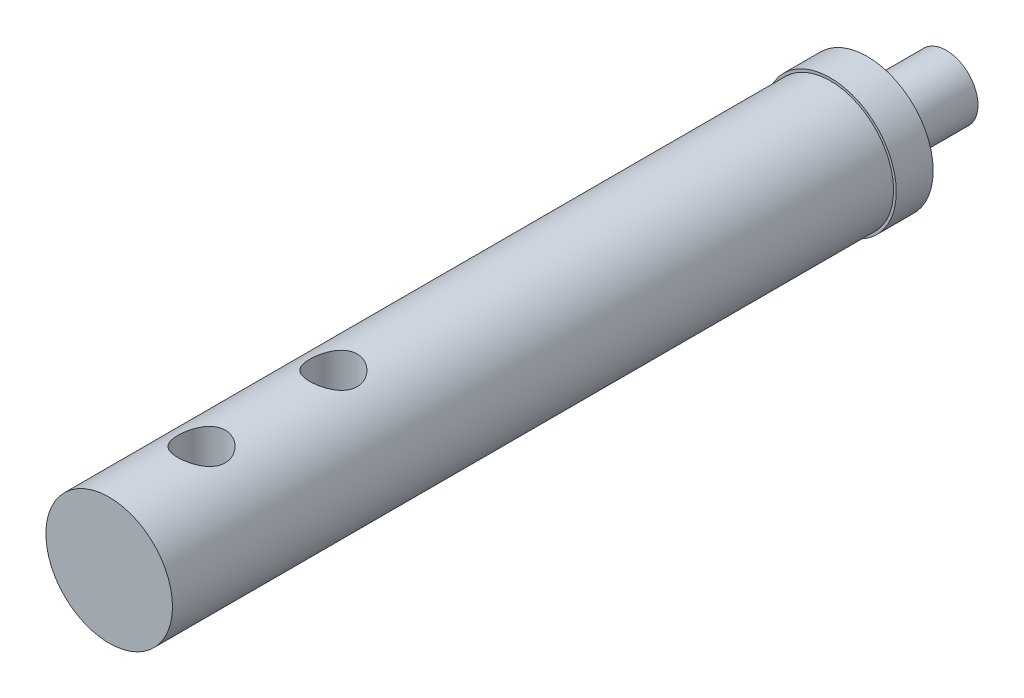
ISO-10303-21;
HEADER;
FILE_DESCRIPTION(('STEP AP214'),'2;1');
FILE_NAME('part.step','',(''),(''),'','','');
FILE_SCHEMA(('AUTOMOTIVE_DESIGN { 1 0 10303 214 1 1 1 1 }'));
ENDSEC;
DATA;
#1=APPLICATION_CONTEXT('core data for automotive mechanical design processes');
#2=APPLICATION_PROTOCOL_DEFINITION('international standard','automotive_design',2000,#1);
#3=PRODUCT_CONTEXT('',#1,'mechanical');
#4=PRODUCT('Part','Part','',(#3));
#5=PRODUCT_RELATED_PRODUCT_CATEGORY('part','',(#4));
#6=PRODUCT_DEFINITION_FORMATION('','',#4);
#7=PRODUCT_DEFINITION_CONTEXT('part definition',#1,'design');
#8=PRODUCT_DEFINITION('design','',#6,#7);
#9=PRODUCT_DEFINITION_SHAPE('','',#8);
#10=(LENGTH_UNIT() NAMED_UNIT(*) SI_UNIT(.MILLI.,.METRE.));
#11=(NAMED_UNIT(*) PLANE_ANGLE_UNIT() SI_UNIT($,.RADIAN.));
#12=(NAMED_UNIT(*) SI_UNIT($,.STERADIAN.) SOLID_ANGLE_UNIT());
#13=UNCERTAINTY_MEASURE_WITH_UNIT(LENGTH_MEASURE(1.E-05),#10,'distance_accuracy_value','');
#14=(GEOMETRIC_REPRESENTATION_CONTEXT(3) GLOBAL_UNCERTAINTY_ASSIGNED_CONTEXT((#13)) GLOBAL_UNIT_ASSIGNED_CONTEXT((#10,
#11,#12)) REPRESENTATION_CONTEXT('',''));
#15=CARTESIAN_POINT('',(0.,0.,0.));
#16=DIRECTION('',(0.,0.,1.));
#17=DIRECTION('',(1.,0.,0.));
#18=AXIS2_PLACEMENT_3D('',#15,#16,#17);
#19=CARTESIAN_POINT('',(0.,0.,15.));
#20=DIRECTION('',(0.,0.,-1.));
#21=DIRECTION('',(-1.,0.,0.));
#22=AXIS2_PLACEMENT_3D('',#19,#20,#21);
#23=CYLINDRICAL_SURFACE('',#22,6.);
#24=CARTESIAN_POINT('',(0.,0.,15.));
#25=DIRECTION('',(0.,0.,1.));
#26=DIRECTION('',(1.,0.,0.));
#27=AXIS2_PLACEMENT_3D('',#24,#25,#26);
#28=CIRCLE('',#27,6.);
#29=CARTESIAN_POINT('',(6.,0.,15.));
#30=VERTEX_POINT('',#29);
#31=EDGE_CURVE('E45',#30,#30,#28,.T.);
#32=ORIENTED_EDGE('',*,*,#31,.F.);
#33=EDGE_LOOP('',(#32));
#34=FACE_BOUND('',#33,.T.);
#35=CARTESIAN_POINT('',(0.,0.,0.));
#36=DIRECTION('',(0.,0.,1.));
#37=DIRECTION('',(1.,0.,0.));
#38=AXIS2_PLACEMENT_3D('',#35,#36,#37);
#39=CIRCLE('',#38,6.);
#40=CARTESIAN_POINT('',(6.,0.,0.));
#41=VERTEX_POINT('',#40);
#42=EDGE_CURVE('E50',#41,#41,#39,.T.);
#43=ORIENTED_EDGE('',*,*,#42,.T.);
#44=EDGE_LOOP('',(#43));
#45=FACE_BOUND('',#44,.T.);
#46=ADVANCED_FACE('F33',(#34,#45),#23,.T.);
#47=CARTESIAN_POINT('',(0.,0.,0.));
#48=DIRECTION('',(0.,0.,1.));
#49=DIRECTION('',(1.,0.,0.));
#50=AXIS2_PLACEMENT_3D('',#47,#48,#49);
#51=PLANE('',#50);
#52=ORIENTED_EDGE('',*,*,#42,.F.);
#53=EDGE_LOOP('',(#52));
#54=FACE_BOUND('',#53,.T.);
#55=ADVANCED_FACE('F95',(#54),#51,.F.);
#56=CARTESIAN_POINT('',(0.,0.,22.));
#57=DIRECTION('',(0.,0.,-1.));
#58=DIRECTION('',(-1.,0.,0.));
#59=AXIS2_PLACEMENT_3D('',#56,#57,#58);
#60=CYLINDRICAL_SURFACE('',#59,12.5);
#61=CARTESIAN_POINT('',(0.,0.,22.));
#62=DIRECTION('',(0.,0.,1.));
#63=DIRECTION('',(1.,0.,0.));
#64=AXIS2_PLACEMENT_3D('',#61,#62,#63);
#65=CIRCLE('',#64,12.5);
#66=CARTESIAN_POINT('',(12.5,0.,22.));
#67=VERTEX_POINT('',#66);
#68=EDGE_CURVE('E55',#67,#67,#65,.T.);
#69=ORIENTED_EDGE('',*,*,#68,.F.);
#70=EDGE_LOOP('',(#69));
#71=FACE_BOUND('',#70,.T.);
#72=CARTESIAN_POINT('',(0.,0.,15.));
#73=DIRECTION('',(0.,0.,1.));
#74=DIRECTION('',(1.,0.,0.));
#75=AXIS2_PLACEMENT_3D('',#72,#73,#74);
#76=CIRCLE('',#75,12.5);
#77=CARTESIAN_POINT('',(12.5,0.,15.));
#78=VERTEX_POINT('',#77);
#79=EDGE_CURVE('E58',#78,#78,#76,.T.);
#80=ORIENTED_EDGE('',*,*,#79,.T.);
#81=EDGE_LOOP('',(#80));
#82=FACE_BOUND('',#81,.T.);
#83=ADVANCED_FACE('F100',(#71,#82),#60,.T.);
#84=CARTESIAN_POINT('',(0.,0.,22.));
#85=DIRECTION('',(0.,0.,1.));
#86=DIRECTION('',(1.,0.,0.));
#87=AXIS2_PLACEMENT_3D('',#84,#85,#86);
#88=PLANE('',#87);
#89=CARTESIAN_POINT('',(0.,0.,22.));
#90=DIRECTION('',(0.,0.,1.));
#91=DIRECTION('',(1.,0.,0.));
#92=AXIS2_PLACEMENT_3D('',#89,#90,#91);
#93=CIRCLE('',#92,12.);
#94=CARTESIAN_POINT('',(12.,0.,22.));
#95=VERTEX_POINT('',#94);
#96=EDGE_CURVE('E10',#95,#95,#93,.T.);
#97=ORIENTED_EDGE('',*,*,#96,.F.);
#98=EDGE_LOOP('',(#97));
#99=FACE_BOUND('',#98,.T.);
#100=ORIENTED_EDGE('',*,*,#68,.T.);
#101=EDGE_LOOP('',(#100));
#102=FACE_BOUND('',#101,.T.);
#103=ADVANCED_FACE('F108',(#99,#102),#88,.T.);
#104=CARTESIAN_POINT('',(0.,0.,15.));
#105=DIRECTION('',(0.,0.,1.));
#106=DIRECTION('',(1.,0.,0.));
#107=AXIS2_PLACEMENT_3D('',#104,#105,#106);
#108=PLANE('',#107);
#109=ORIENTED_EDGE('',*,*,#31,.T.);
#110=EDGE_LOOP('',(#109));
#111=FACE_BOUND('',#110,.T.);
#112=ORIENTED_EDGE('',*,*,#79,.F.);
#113=EDGE_LOOP('',(#112));
#114=FACE_BOUND('',#113,.T.);
#115=ADVANCED_FACE('F91',(#111,#114),#108,.F.);
#116=CARTESIAN_POINT('',(0.,0.,158.7));
#117=DIRECTION('',(0.,0.,-1.));
#118=DIRECTION('',(-1.,0.,0.));
#119=AXIS2_PLACEMENT_3D('',#116,#117,#118);
#120=CYLINDRICAL_SURFACE('',#119,12.);
#121=CARTESIAN_POINT('',(0.,-12.,120.7));
#122=CARTESIAN_POINT('',(0.12182192021614,-12.0000004149463,120.700000562589));
#123=CARTESIAN_POINT('',(0.243636002691334,-11.9981409348073,120.695049364538));
#124=CARTESIAN_POINT('',(0.486392423781213,-11.9907535477711,120.675293911887));
#125=CARTESIAN_POINT('',(0.607334471202249,-11.9852244680872,120.660486507286));
#126=CARTESIAN_POINT('',(0.847347381687181,-11.970649565472,120.621174413435));
#127=CARTESIAN_POINT('',(0.966419205128127,-11.9616056132673,120.596674882519));
#128=CARTESIAN_POINT('',(1.20195810401349,-11.9402382455256,120.53820576059));
#129=CARTESIAN_POINT('',(1.31842414848255,-11.9279135559973,120.504232490447));
#130=CARTESIAN_POINT('',(1.54765442429003,-11.9003384511568,120.427214849951));
#131=CARTESIAN_POINT('',(1.660426734491,-11.8850950009216,120.384192050998));
#132=CARTESIAN_POINT('',(1.88185705605878,-11.8520536393113,120.289393964956));
#133=CARTESIAN_POINT('',(1.99051352350808,-11.8342547811235,120.237615432482));
#134=CARTESIAN_POINT('',(2.30927279411985,-11.7776768093622,120.069731594457));
#135=CARTESIAN_POINT('',(2.51234231941558,-11.7356939966761,119.941018203868));
#136=CARTESIAN_POINT('',(2.90206977477989,-11.6455850212357,119.648156633399));
#137=CARTESIAN_POINT('',(3.08780172063126,-11.5972851945296,119.482840477992));
#138=CARTESIAN_POINT('',(3.42974311725176,-11.500801507554,119.123737421702));
#139=CARTESIAN_POINT('',(3.58594353155377,-11.4526176872201,118.929941838426));
#140=CARTESIAN_POINT('',(3.79764477617944,-11.3834841407686,118.617559070828));
#141=CARTESIAN_POINT('',(3.86547493196535,-11.3605705131175,118.507562616254));
#142=CARTESIAN_POINT('',(3.99157408188854,-11.3168804194774,118.281831512047));
#143=CARTESIAN_POINT('',(4.04984690983614,-11.2961030977882,118.166099187672));
#144=CARTESIAN_POINT('',(4.15634309619243,-11.2573544123991,117.929634242611));
#145=CARTESIAN_POINT('',(4.20456527896396,-11.2393833770156,117.808901038945));
#146=CARTESIAN_POINT('',(4.29047551547084,-11.2068698048304,117.563350953977));
#147=CARTESIAN_POINT('',(4.32816865016454,-11.1923256148824,117.438536074949));
#148=CARTESIAN_POINT('',(4.39133833063889,-11.167687799886,117.190864282486));
#149=CARTESIAN_POINT('',(4.41724869222401,-11.1574374723367,117.068133574559));
#150=CARTESIAN_POINT('',(4.45874705417236,-11.1409189584307,116.820724885637));
#151=CARTESIAN_POINT('',(4.47433956871922,-11.1346490306496,116.696047780687));
#152=CARTESIAN_POINT('',(4.49504192825721,-11.1263077224061,116.445703904304));
#153=CARTESIAN_POINT('',(4.50015334189904,-11.124235713664,116.320037283793));
#154=CARTESIAN_POINT('',(4.4998396408155,-11.124362586323,116.068723898627));
#155=CARTESIAN_POINT('',(4.49441493477359,-11.1265613020677,115.94307713339));
#156=CARTESIAN_POINT('',(4.47373138181252,-11.1348931002806,115.700345583509));
#157=CARTESIAN_POINT('',(4.45908334347361,-11.1407817124043,115.583200175152));
#158=CARTESIAN_POINT('',(4.42068867776498,-11.1560711786316,115.350631735769));
#159=CARTESIAN_POINT('',(4.39693902815625,-11.1654731993557,115.235209290103));
#160=CARTESIAN_POINT('',(4.31234407385655,-11.1985472030748,114.892770983112));
#161=CARTESIAN_POINT('',(4.23813423625877,-11.2270952052095,114.669371280221));
#162=CARTESIAN_POINT('',(4.05490721343479,-11.294571324263,114.234132319446));
#163=CARTESIAN_POINT('',(3.94525805379048,-11.3336856090865,114.02259174478));
#164=CARTESIAN_POINT('',(3.69468362169032,-11.417826234714,113.620172587469));
#165=CARTESIAN_POINT('',(3.55374755073014,-11.4628546145386,113.429301172593));
#166=CARTESIAN_POINT('',(3.23345300799873,-11.5574411862383,113.060186122089));
#167=CARTESIAN_POINT('',(3.05214885027356,-11.607100429164,112.88365330368));
#168=CARTESIAN_POINT('',(2.66193788370926,-11.7027518394278,112.562986875577));
#169=CARTESIAN_POINT('',(2.45302684040983,-11.748743442469,112.418858245353));
#170=CARTESIAN_POINT('',(2.00917028059689,-11.8327918458053,112.165208596408));
#171=CARTESIAN_POINT('',(1.77387213379262,-11.8707149483013,112.056257198474));
#172=CARTESIAN_POINT('',(1.28651055931184,-11.9333615492963,111.880052245027));
#173=CARTESIAN_POINT('',(1.03445463312944,-11.9580909097264,111.8127801694));
#174=CARTESIAN_POINT('',(0.535125728885336,-11.9905332973328,111.725131619306));
#175=CARTESIAN_POINT('',(0.288310863440806,-11.9990810722223,111.702452162351));
#176=CARTESIAN_POINT('',(-0.205717430518199,-12.0007768095524,111.697926826798));
#177=CARTESIAN_POINT('',(-0.452930758520922,-11.9939281862917,111.716071894972));
#178=CARTESIAN_POINT('',(-0.930786126866777,-11.9661512982893,111.790930073153));
#179=CARTESIAN_POINT('',(-1.16169991458787,-11.9457741475744,111.846134437354));
#180=CARTESIAN_POINT('',(-1.61082533431484,-11.8935442940439,111.991558411525));
#181=CARTESIAN_POINT('',(-1.82903531000967,-11.8616900987367,112.081782575637));
#182=CARTESIAN_POINT('',(-2.25374302875423,-11.7884888040033,112.297558494317));
#183=CARTESIAN_POINT('',(-2.45970824228691,-11.7468902777666,112.424070377444));
#184=CARTESIAN_POINT('',(-2.84817914393921,-11.6587998753534,112.70775712078));
#185=CARTESIAN_POINT('',(-3.03067612982123,-11.6123061955645,112.864943301224));
#186=CARTESIAN_POINT('',(-3.37808840855274,-11.516200958323,113.216201253386));
#187=CARTESIAN_POINT('',(-3.54136933947528,-11.4665650100462,113.411883953797));
#188=CARTESIAN_POINT('',(-3.83314678656079,-11.372360357102,113.828996752467));
#189=CARTESIAN_POINT('',(-3.96164017919755,-11.3277921076647,114.050429160208));
#190=CARTESIAN_POINT('',(-4.12541953452075,-11.2687303690453,114.397922796397));
#191=CARTESIAN_POINT('',(-4.17527938653558,-11.2503030894951,114.516647329586));
#192=CARTESIAN_POINT('',(-4.26475585416722,-11.2166905930926,114.758323845116));
#193=CARTESIAN_POINT('',(-4.30437682733461,-11.2015039975232,114.881274003754));
#194=CARTESIAN_POINT('',(-4.37296242168505,-11.1749073223601,115.130466472104));
#195=CARTESIAN_POINT('',(-4.40193024471253,-11.163496108165,115.256707780413));
#196=CARTESIAN_POINT('',(-4.44890662829911,-11.1448585297206,115.51151813959));
#197=CARTESIAN_POINT('',(-4.46691595320738,-11.1376318736025,115.640087027466));
#198=CARTESIAN_POINT('',(-4.4909611175474,-11.1279568107625,115.890138338187));
#199=CARTESIAN_POINT('',(-4.4976937576826,-11.1252304971503,116.011543515748));
#200=CARTESIAN_POINT('',(-4.50131029580419,-11.1237678185175,116.254568299403));
#201=CARTESIAN_POINT('',(-4.49819087218451,-11.1250327991546,116.376187963996));
#202=CARTESIAN_POINT('',(-4.48213280066959,-11.131512007523,116.618611778483));
#203=CARTESIAN_POINT('',(-4.46919877710472,-11.1367243753675,116.739416285416));
#204=CARTESIAN_POINT('',(-4.4336489114592,-11.150924738849,116.979410101132));
#205=CARTESIAN_POINT('',(-4.41102942370239,-11.1599141561698,117.098598784262));
#206=CARTESIAN_POINT('',(-4.35718066722756,-11.1810458214159,117.330811506595));
#207=CARTESIAN_POINT('',(-4.3262397945842,-11.1930817833517,117.443912139277));
#208=CARTESIAN_POINT('',(-4.25575591081443,-11.220069483486,117.667056271898));
#209=CARTESIAN_POINT('',(-4.21620988547499,-11.23502224319,117.777098685333));
#210=CARTESIAN_POINT('',(-4.08512625929658,-11.2836374066331,118.101595505612));
#211=CARTESIAN_POINT('',(-3.98110253179988,-11.3210734609741,118.310592817196));
#212=CARTESIAN_POINT('',(-3.73655960136619,-11.4041928736043,118.719509886323));
#213=CARTESIAN_POINT('',(-3.59441315608532,-11.4502056852775,118.918379513829));
#214=CARTESIAN_POINT('',(-3.28000639093495,-11.5441926723435,119.290437563583));
#215=CARTESIAN_POINT('',(-3.10773650011231,-11.5921674673836,119.463617791262));
#216=CARTESIAN_POINT('',(-2.82485495768739,-11.6632064644304,119.705245875948));
#217=CARTESIAN_POINT('',(-2.72355677041141,-11.6873329442322,119.784523984934));
#218=CARTESIAN_POINT('',(-2.51433251035992,-11.7341212355869,119.934254321495));
#219=CARTESIAN_POINT('',(-2.40640888366379,-11.7567835814237,120.004709777492));
#220=CARTESIAN_POINT('',(-2.18454509687349,-11.8000231112314,120.136294134108));
#221=CARTESIAN_POINT('',(-2.07060177268691,-11.8205991816831,120.197418062869));
#222=CARTESIAN_POINT('',(-1.83755175113718,-11.8590616275344,120.309759993606));
#223=CARTESIAN_POINT('',(-1.71844727331546,-11.8769491446375,120.36098220304));
#224=CARTESIAN_POINT('',(-1.47053797162901,-11.9102407175975,120.455097964792));
#225=CARTESIAN_POINT('',(-1.3415368617529,-11.9255011706843,120.497526838323));
#226=CARTESIAN_POINT('',(-1.07989915577462,-11.9520331999052,120.570612963128));
#227=CARTESIAN_POINT('',(-0.947264179674948,-11.9633065233273,120.601275371347));
#228=CARTESIAN_POINT('',(-0.679492491904578,-11.9814979813589,120.650485060083));
#229=CARTESIAN_POINT('',(-0.544356226207069,-11.9884168847946,120.669034479318));
#230=CARTESIAN_POINT('',(-0.272809934790551,-11.9976674031164,120.693790938277));
#231=CARTESIAN_POINT('',(-0.136400054481801,-11.9999995353981,120.699999370088));
#232=CARTESIAN_POINT('',(0.,-12.,120.7));
#233=B_SPLINE_CURVE_WITH_KNOTS('',3,(#121,#122,#123,#124,#125,#126,#127,#128,#129,#130,#131,
#132,#133,#134,#135,#136,#137,#138,#139,#140,#141,#142,#143,#144,#145,#146,#147,#148,#149,#150,
#151,#152,#153,#154,#155,#156,#157,#158,#159,#160,#161,#162,#163,#164,#165,#166,#167,#168,#169,
#170,#171,#172,#173,#174,#175,#176,#177,#178,#179,#180,#181,#182,#183,#184,#185,#186,#187,#188,
#189,#190,#191,#192,#193,#194,#195,#196,#197,#198,#199,#200,#201,#202,#203,#204,#205,#206,#207,
#208,#209,#210,#211,#212,#213,#214,#215,#216,#217,#218,#219,#220,#221,#222,#223,#224,#225,#226,
#227,#228,#229,#230,#231,#232),.UNSPECIFIED.,.T.,.F.,(4,2,2,2,2,2,2,2,2,2,2,2,2,2,2,2,2,2,2,2,2,
2,2,2,2,2,2,2,2,2,2,2,2,2,2,2,2,2,2,2,2,2,2,2,2,2,2,2,2,2,2,2,2,2,2,4),(0.,0.365338024506952,
0.730792865566524,1.09605346575197,1.46145611308565,1.82599742407274,2.19067415273862,
2.91947018392638,3.67616860257938,4.43309819286655,4.82642681378562,5.21959726757258,
5.61281368524465,6.00584002102326,6.38291145568139,6.75981780772977,7.13666774608809,
7.51350306718049,7.86768402280121,8.22198268815954,8.92994647641831,9.65130458621118,
10.3729120569284,11.143016934675,11.9132400717526,12.6953735931829,13.477159325566,
14.2173829236784,14.9574423863163,15.6690654723159,16.3807811322343,17.1134089903886,
17.8463077351967,18.6217279182704,19.3972177022049,19.7870381951625,20.1766925107004,
20.5662296182681,20.9557395527225,21.3201489316714,21.6846811837186,22.0490417862153,
22.4135396573091,22.7667469946614,23.1200782532196,23.8262105801188,24.5693581369517,
25.3127422403354,25.7049754844993,26.0970647789657,26.4893622558027,26.8814926686161,
27.2908478409866,27.7000233978563,28.1091266894863,28.5181838309154),.UNSPECIFIED.);
#234=CARTESIAN_POINT('',(0.,-12.,120.7));
#235=VERTEX_POINT('',#234);
#236=EDGE_CURVE('E36',#235,#235,#233,.T.);
#237=ORIENTED_EDGE('',*,*,#236,.T.);
#238=EDGE_LOOP('',(#237));
#239=FACE_BOUND('',#238,.T.);
#240=CARTESIAN_POINT('',(0.,12.,120.7));
#241=CARTESIAN_POINT('',(-0.121821920216147,12.0000004149463,120.700000562589));
#242=CARTESIAN_POINT('',(-0.243636002691342,11.9981409348073,120.695049364538));
#243=CARTESIAN_POINT('',(-0.486392423781221,11.9907535477711,120.675293911887));
#244=CARTESIAN_POINT('',(-0.607334471202256,11.9852244680872,120.660486507286));
#245=CARTESIAN_POINT('',(-0.847347381687191,11.970649565472,120.621174413435));
#246=CARTESIAN_POINT('',(-0.966419205128139,11.9616056132673,120.596674882519));
#247=CARTESIAN_POINT('',(-1.20195810401351,11.9402382455256,120.53820576059));
#248=CARTESIAN_POINT('',(-1.31842414848256,11.9279135559973,120.504232490447));
#249=CARTESIAN_POINT('',(-1.54765442429004,11.9003384511568,120.427214849951));
#250=CARTESIAN_POINT('',(-1.66042673449101,11.8850950009216,120.384192050998));
#251=CARTESIAN_POINT('',(-1.88185705605879,11.8520536393113,120.289393964956));
#252=CARTESIAN_POINT('',(-1.99051352350809,11.8342547811235,120.237615432482));
#253=CARTESIAN_POINT('',(-2.30927279411986,11.7776768093622,120.069731594457));
#254=CARTESIAN_POINT('',(-2.51234231941558,11.7356939966761,119.941018203868));
#255=CARTESIAN_POINT('',(-2.9020697747799,11.6455850212357,119.648156633399));
#256=CARTESIAN_POINT('',(-3.08780172063126,11.5972851945296,119.482840477992));
#257=CARTESIAN_POINT('',(-3.42974311725176,11.500801507554,119.123737421702));
#258=CARTESIAN_POINT('',(-3.58594353155377,11.4526176872201,118.929941838426));
#259=CARTESIAN_POINT('',(-3.79764477617945,11.3834841407686,118.617559070828));
#260=CARTESIAN_POINT('',(-3.86547493196535,11.3605705131175,118.507562616254));
#261=CARTESIAN_POINT('',(-3.99157408188855,11.3168804194774,118.281831512047));
#262=CARTESIAN_POINT('',(-4.04984690983615,11.2961030977882,118.166099187672));
#263=CARTESIAN_POINT('',(-4.15634309619243,11.2573544123991,117.929634242611));
#264=CARTESIAN_POINT('',(-4.20456527896397,11.2393833770156,117.808901038945));
#265=CARTESIAN_POINT('',(-4.29047551547084,11.2068698048304,117.563350953977));
#266=CARTESIAN_POINT('',(-4.32816865016454,11.1923256148824,117.438536074949));
#267=CARTESIAN_POINT('',(-4.3913383306389,11.167687799886,117.190864282486));
#268=CARTESIAN_POINT('',(-4.41724869222401,11.1574374723367,117.068133574559));
#269=CARTESIAN_POINT('',(-4.45874705417236,11.1409189584307,116.820724885637));
#270=CARTESIAN_POINT('',(-4.47433956871923,11.1346490306496,116.696047780687));
#271=CARTESIAN_POINT('',(-4.49504192825722,11.1263077224061,116.445703904304));
#272=CARTESIAN_POINT('',(-4.50015334189905,11.124235713664,116.320037283793));
#273=CARTESIAN_POINT('',(-4.49983964081551,11.124362586323,116.068723898627));
#274=CARTESIAN_POINT('',(-4.4944149347736,11.1265613020677,115.94307713339));
#275=CARTESIAN_POINT('',(-4.47373138181252,11.1348931002806,115.700345583509));
#276=CARTESIAN_POINT('',(-4.45908334347362,11.1407817124043,115.583200175152));
#277=CARTESIAN_POINT('',(-4.42068867776498,11.1560711786316,115.350631735769));
#278=CARTESIAN_POINT('',(-4.39693902815625,11.1654731993557,115.235209290103));
#279=CARTESIAN_POINT('',(-4.31234407385656,11.1985472030748,114.892770983112));
#280=CARTESIAN_POINT('',(-4.23813423625878,11.2270952052095,114.669371280221));
#281=CARTESIAN_POINT('',(-4.05490721343479,11.294571324263,114.234132319446));
#282=CARTESIAN_POINT('',(-3.94525805379049,11.3336856090865,114.02259174478));
#283=CARTESIAN_POINT('',(-3.69468362169033,11.417826234714,113.620172587469));
#284=CARTESIAN_POINT('',(-3.55374755073015,11.4628546145386,113.429301172593));
#285=CARTESIAN_POINT('',(-3.23345300799873,11.5574411862383,113.060186122089));
#286=CARTESIAN_POINT('',(-3.05214885027357,11.607100429164,112.88365330368));
#287=CARTESIAN_POINT('',(-2.66193788370927,11.7027518394278,112.562986875577));
#288=CARTESIAN_POINT('',(-2.45302684040983,11.748743442469,112.418858245353));
#289=CARTESIAN_POINT('',(-2.0091702805969,11.8327918458053,112.165208596408));
#290=CARTESIAN_POINT('',(-1.77387213379263,11.8707149483013,112.056257198474));
#291=CARTESIAN_POINT('',(-1.28651055931185,11.9333615492963,111.880052245027));
#292=CARTESIAN_POINT('',(-1.03445463312945,11.9580909097264,111.8127801694));
#293=CARTESIAN_POINT('',(-0.535125728885344,11.9905332973328,111.725131619306));
#294=CARTESIAN_POINT('',(-0.288310863440814,11.9990810722223,111.702452162351));
#295=CARTESIAN_POINT('',(0.205717430518191,12.0007768095524,111.697926826798));
#296=CARTESIAN_POINT('',(0.452930758520915,11.9939281862917,111.716071894972));
#297=CARTESIAN_POINT('',(0.93078612686677,11.9661512982893,111.790930073153));
#298=CARTESIAN_POINT('',(1.16169991458786,11.9457741475744,111.846134437354));
#299=CARTESIAN_POINT('',(1.61082533431483,11.8935442940439,111.991558411525));
#300=CARTESIAN_POINT('',(1.82903531000967,11.8616900987367,112.081782575637));
#301=CARTESIAN_POINT('',(2.25374302875422,11.7884888040033,112.297558494317));
#302=CARTESIAN_POINT('',(2.4597082422869,11.7468902777666,112.424070377444));
#303=CARTESIAN_POINT('',(2.8481791439392,11.6587998753534,112.70775712078));
#304=CARTESIAN_POINT('',(3.03067612982123,11.6123061955645,112.864943301224));
#305=CARTESIAN_POINT('',(3.37808840855273,11.516200958323,113.216201253386));
#306=CARTESIAN_POINT('',(3.54136933947527,11.4665650100462,113.411883953797));
#307=CARTESIAN_POINT('',(3.83314678656079,11.372360357102,113.828996752467));
#308=CARTESIAN_POINT('',(3.96164017919754,11.3277921076647,114.050429160208));
#309=CARTESIAN_POINT('',(4.12541953452074,11.2687303690453,114.397922796397));
#310=CARTESIAN_POINT('',(4.17527938653557,11.2503030894951,114.516647329586));
#311=CARTESIAN_POINT('',(4.26475585416721,11.2166905930926,114.758323845116));
#312=CARTESIAN_POINT('',(4.3043768273346,11.2015039975232,114.881274003754));
#313=CARTESIAN_POINT('',(4.37296242168504,11.1749073223601,115.130466472104));
#314=CARTESIAN_POINT('',(4.40193024471253,11.163496108165,115.256707780413));
#315=CARTESIAN_POINT('',(4.4489066282991,11.1448585297206,115.51151813959));
#316=CARTESIAN_POINT('',(4.46691595320738,11.1376318736025,115.640087027466));
#317=CARTESIAN_POINT('',(4.49096111754739,11.1279568107625,115.890138338187));
#318=CARTESIAN_POINT('',(4.49769375768259,11.1252304971503,116.011543515748));
#319=CARTESIAN_POINT('',(4.50131029580418,11.1237678185175,116.254568299403));
#320=CARTESIAN_POINT('',(4.4981908721845,11.1250327991546,116.376187963996));
#321=CARTESIAN_POINT('',(4.48213280066958,11.131512007523,116.618611778483));
#322=CARTESIAN_POINT('',(4.46919877710471,11.1367243753675,116.739416285416));
#323=CARTESIAN_POINT('',(4.4336489114592,11.150924738849,116.979410101132));
#324=CARTESIAN_POINT('',(4.41102942370238,11.1599141561698,117.098598784262));
#325=CARTESIAN_POINT('',(4.35718066722755,11.1810458214159,117.330811506595));
#326=CARTESIAN_POINT('',(4.3262397945842,11.1930817833517,117.443912139277));
#327=CARTESIAN_POINT('',(4.25575591081442,11.220069483486,117.667056271898));
#328=CARTESIAN_POINT('',(4.21620988547499,11.23502224319,117.777098685333));
#329=CARTESIAN_POINT('',(4.08512625929658,11.2836374066331,118.101595505612));
#330=CARTESIAN_POINT('',(3.98110253179987,11.3210734609741,118.310592817196));
#331=CARTESIAN_POINT('',(3.73655960136618,11.4041928736043,118.719509886323));
#332=CARTESIAN_POINT('',(3.59441315608531,11.4502056852775,118.918379513829));
#333=CARTESIAN_POINT('',(3.28000639093494,11.5441926723435,119.290437563583));
#334=CARTESIAN_POINT('',(3.1077365001123,11.5921674673836,119.463617791262));
#335=CARTESIAN_POINT('',(2.82485495768738,11.6632064644304,119.705245875948));
#336=CARTESIAN_POINT('',(2.7235567704114,11.6873329442322,119.784523984934));
#337=CARTESIAN_POINT('',(2.51433251035991,11.7341212355869,119.934254321495));
#338=CARTESIAN_POINT('',(2.40640888366378,11.7567835814237,120.004709777492));
#339=CARTESIAN_POINT('',(2.18454509687348,11.8000231112314,120.136294134108));
#340=CARTESIAN_POINT('',(2.0706017726869,11.8205991816831,120.197418062869));
#341=CARTESIAN_POINT('',(1.83755175113716,11.8590616275344,120.309759993606));
#342=CARTESIAN_POINT('',(1.71844727331545,11.8769491446375,120.36098220304));
#343=CARTESIAN_POINT('',(1.470537971629,11.9102407175975,120.455097964792));
#344=CARTESIAN_POINT('',(1.34153686175289,11.9255011706843,120.497526838323));
#345=CARTESIAN_POINT('',(1.07989915577462,11.9520331999052,120.570612963128));
#346=CARTESIAN_POINT('',(0.94726417967494,11.9633065233273,120.601275371347));
#347=CARTESIAN_POINT('',(0.67949249190457,11.9814979813589,120.650485060083));
#348=CARTESIAN_POINT('',(0.544356226207062,11.9884168847946,120.669034479318));
#349=CARTESIAN_POINT('',(0.272809934790544,11.9976674031164,120.693790938277));
#350=CARTESIAN_POINT('',(0.136400054481794,11.9999995353981,120.699999370088));
#351=CARTESIAN_POINT('',(0.,12.,120.7));
#352=B_SPLINE_CURVE_WITH_KNOTS('',3,(#240,#241,#242,#243,#244,#245,#246,#247,#248,#249,#250,
#251,#252,#253,#254,#255,#256,#257,#258,#259,#260,#261,#262,#263,#264,#265,#266,#267,#268,#269,
#270,#271,#272,#273,#274,#275,#276,#277,#278,#279,#280,#281,#282,#283,#284,#285,#286,#287,#288,
#289,#290,#291,#292,#293,#294,#295,#296,#297,#298,#299,#300,#301,#302,#303,#304,#305,#306,#307,
#308,#309,#310,#311,#312,#313,#314,#315,#316,#317,#318,#319,#320,#321,#322,#323,#324,#325,#326,
#327,#328,#329,#330,#331,#332,#333,#334,#335,#336,#337,#338,#339,#340,#341,#342,#343,#344,#345,
#346,#347,#348,#349,#350,#351),.UNSPECIFIED.,.T.,.F.,(4,2,2,2,2,2,2,2,2,2,2,2,2,2,2,2,2,2,2,2,2,
2,2,2,2,2,2,2,2,2,2,2,2,2,2,2,2,2,2,2,2,2,2,2,2,2,2,2,2,2,2,2,2,2,2,4),(0.,0.365338024506952,
0.730792865566525,1.09605346575198,1.46145611308565,1.82599742407274,2.19067415273862,
2.91947018392638,3.67616860257938,4.43309819286655,4.82642681378562,5.21959726757258,
5.61281368524465,6.00584002102326,6.38291145568136,6.75981780772974,7.13666774608808,
7.51350306718048,7.86768402280121,8.22198268815954,8.92994647641831,9.65130458621118,
10.3729120569284,11.143016934675,11.9132400717526,12.6953735931829,13.477159325566,
14.2173829236784,14.9574423863163,15.6690654723159,16.3807811322343,17.1134089903886,
17.8463077351967,18.6217279182704,19.3972177022049,19.7870381951625,20.1766925107004,
20.566229618268,20.9557395527224,21.3201489316714,21.6846811837186,22.0490417862153,
22.4135396573091,22.7667469946614,23.1200782532196,23.8262105801188,24.5693581369517,
25.3127422403354,25.7049754844993,26.0970647789657,26.4893622558027,26.8814926686161,
27.2908478409866,27.7000233978563,28.1091266894863,28.5181838309154),.UNSPECIFIED.);
#353=CARTESIAN_POINT('',(0.,12.,120.7));
#354=VERTEX_POINT('',#353);
#355=EDGE_CURVE('E156',#354,#354,#352,.T.);
#356=ORIENTED_EDGE('',*,*,#355,.T.);
#357=EDGE_LOOP('',(#356));
#358=FACE_BOUND('',#357,.T.);
#359=CARTESIAN_POINT('',(0.,-12.,145.7));
#360=CARTESIAN_POINT('',(0.121821920216141,-12.0000004149463,145.700000562589));
#361=CARTESIAN_POINT('',(0.243636002691335,-11.9981409348073,145.695049364538));
#362=CARTESIAN_POINT('',(0.486392423781216,-11.9907535477711,145.675293911887));
#363=CARTESIAN_POINT('',(0.607334471202253,-11.9852244680872,145.660486507286));
#364=CARTESIAN_POINT('',(0.84734738168719,-11.970649565472,145.621174413436));
#365=CARTESIAN_POINT('',(0.966419205128139,-11.9616056132673,145.596674882519));
#366=CARTESIAN_POINT('',(1.20195810401351,-11.9402382455256,145.53820576059));
#367=CARTESIAN_POINT('',(1.31842414848256,-11.9279135559973,145.504232490447));
#368=CARTESIAN_POINT('',(1.54765442429004,-11.9003384511568,145.427214849951));
#369=CARTESIAN_POINT('',(1.660426734491,-11.8850950009216,145.384192050998));
#370=CARTESIAN_POINT('',(1.88185705605878,-11.8520536393113,145.289393964957));
#371=CARTESIAN_POINT('',(1.99051352350808,-11.8342547811235,145.237615432482));
#372=CARTESIAN_POINT('',(2.30927279411985,-11.7776768093622,145.069731594457));
#373=CARTESIAN_POINT('',(2.51234231941558,-11.7356939966761,144.941018203868));
#374=CARTESIAN_POINT('',(2.90206977477989,-11.6455850212357,144.648156633399));
#375=CARTESIAN_POINT('',(3.08780172063126,-11.5972851945296,144.482840477992));
#376=CARTESIAN_POINT('',(3.42974311725176,-11.500801507554,144.123737421702));
#377=CARTESIAN_POINT('',(3.58594353155377,-11.4526176872201,143.929941838426));
#378=CARTESIAN_POINT('',(3.79764477617944,-11.3834841407686,143.617559070828));
#379=CARTESIAN_POINT('',(3.86547493196535,-11.3605705131175,143.507562616254));
#380=CARTESIAN_POINT('',(3.99157408188855,-11.3168804194774,143.281831512047));
#381=CARTESIAN_POINT('',(4.04984690983616,-11.2961030977882,143.166099187672));
#382=CARTESIAN_POINT('',(4.15634309619244,-11.257354412399,142.929634242611));
#383=CARTESIAN_POINT('',(4.20456527896397,-11.2393833770156,142.808901038945));
#384=CARTESIAN_POINT('',(4.29047551547084,-11.2068698048304,142.563350953977));
#385=CARTESIAN_POINT('',(4.32816865016454,-11.1923256148824,142.438536074949));
#386=CARTESIAN_POINT('',(4.39133833063889,-11.167687799886,142.190864282486));
#387=CARTESIAN_POINT('',(4.41724869222401,-11.1574374723367,142.068133574559));
#388=CARTESIAN_POINT('',(4.45874705417236,-11.1409189584307,141.820724885637));
#389=CARTESIAN_POINT('',(4.47433956871922,-11.1346490306496,141.696047780687));
#390=CARTESIAN_POINT('',(4.49504192825721,-11.1263077224061,141.445703904304));
#391=CARTESIAN_POINT('',(4.50015334189904,-11.124235713664,141.320037283793));
#392=CARTESIAN_POINT('',(4.4998396408155,-11.124362586323,141.068723898627));
#393=CARTESIAN_POINT('',(4.49441493477359,-11.1265613020677,140.94307713339));
#394=CARTESIAN_POINT('',(4.47373138181252,-11.1348931002806,140.700345583509));
#395=CARTESIAN_POINT('',(4.45908334347361,-11.1407817124043,140.583200175152));
#396=CARTESIAN_POINT('',(4.42068867776497,-11.1560711786316,140.350631735769));
#397=CARTESIAN_POINT('',(4.39693902815624,-11.1654731993557,140.235209290103));
#398=CARTESIAN_POINT('',(4.31234407385654,-11.1985472030748,139.892770983111));
#399=CARTESIAN_POINT('',(4.23813423625877,-11.2270952052095,139.669371280221));
#400=CARTESIAN_POINT('',(4.05490721343479,-11.294571324263,139.234132319446));
#401=CARTESIAN_POINT('',(3.94525805379049,-11.3336856090865,139.02259174478));
#402=CARTESIAN_POINT('',(3.69468362169033,-11.417826234714,138.620172587469));
#403=CARTESIAN_POINT('',(3.55374755073014,-11.4628546145386,138.429301172593));
#404=CARTESIAN_POINT('',(3.23345300799871,-11.5574411862383,138.060186122089));
#405=CARTESIAN_POINT('',(3.05214885027354,-11.607100429164,137.88365330368));
#406=CARTESIAN_POINT('',(2.66193788370923,-11.7027518394278,137.562986875577));
#407=CARTESIAN_POINT('',(2.4530268404098,-11.7487434424691,137.418858245353));
#408=CARTESIAN_POINT('',(2.00917028059687,-11.8327918458053,137.165208596408));
#409=CARTESIAN_POINT('',(1.77387213379261,-11.8707149483013,137.056257198474));
#410=CARTESIAN_POINT('',(1.28651055931184,-11.9333615492963,136.880052245027));
#411=CARTESIAN_POINT('',(1.03445463312944,-11.9580909097264,136.8127801694));
#412=CARTESIAN_POINT('',(0.535125728885332,-11.9905332973328,136.725131619306));
#413=CARTESIAN_POINT('',(0.288310863440802,-11.9990810722223,136.702452162351));
#414=CARTESIAN_POINT('',(-0.205717430518205,-12.0007768095524,136.697926826798));
#415=CARTESIAN_POINT('',(-0.452930758520928,-11.9939281862917,136.716071894972));
#416=CARTESIAN_POINT('',(-0.930786126866782,-11.9661512982893,136.790930073153));
#417=CARTESIAN_POINT('',(-1.16169991458787,-11.9457741475744,136.846134437354));
#418=CARTESIAN_POINT('',(-1.61082533431484,-11.8935442940439,136.991558411524));
#419=CARTESIAN_POINT('',(-1.82903531000967,-11.8616900987367,137.081782575637));
#420=CARTESIAN_POINT('',(-2.25374302875423,-11.7884888040033,137.297558494317));
#421=CARTESIAN_POINT('',(-2.4597082422869,-11.7468902777666,137.424070377444));
#422=CARTESIAN_POINT('',(-2.84817914393921,-11.6587998753534,137.70775712078));
#423=CARTESIAN_POINT('',(-3.03067612982124,-11.6123061955645,137.864943301224));
#424=CARTESIAN_POINT('',(-3.37808840855274,-11.516200958323,138.216201253386));
#425=CARTESIAN_POINT('',(-3.54136933947528,-11.4665650100462,138.411883953797));
#426=CARTESIAN_POINT('',(-3.83314678656079,-11.372360357102,138.828996752467));
#427=CARTESIAN_POINT('',(-3.96164017919755,-11.3277921076647,139.050429160208));
#428=CARTESIAN_POINT('',(-4.12541953452075,-11.2687303690453,139.397922796397));
#429=CARTESIAN_POINT('',(-4.17527938653558,-11.2503030894951,139.516647329586));
#430=CARTESIAN_POINT('',(-4.26475585416722,-11.2166905930926,139.758323845116));
#431=CARTESIAN_POINT('',(-4.30437682733461,-11.2015039975232,139.881274003754));
#432=CARTESIAN_POINT('',(-4.37296242168505,-11.1749073223601,140.130466472104));
#433=CARTESIAN_POINT('',(-4.40193024471254,-11.163496108165,140.256707780413));
#434=CARTESIAN_POINT('',(-4.44890662829911,-11.1448585297206,140.51151813959));
#435=CARTESIAN_POINT('',(-4.46691595320738,-11.1376318736025,140.640087027466));
#436=CARTESIAN_POINT('',(-4.4909611175474,-11.1279568107625,140.890138338187));
#437=CARTESIAN_POINT('',(-4.4976937576826,-11.1252304971503,141.011543515748));
#438=CARTESIAN_POINT('',(-4.50131029580419,-11.1237678185175,141.254568299403));
#439=CARTESIAN_POINT('',(-4.49819087218451,-11.1250327991546,141.376187963996));
#440=CARTESIAN_POINT('',(-4.48213280066959,-11.131512007523,141.618611778483));
#441=CARTESIAN_POINT('',(-4.46919877710471,-11.1367243753675,141.739416285416));
#442=CARTESIAN_POINT('',(-4.4336489114592,-11.150924738849,141.979410101132));
#443=CARTESIAN_POINT('',(-4.41102942370239,-11.1599141561698,142.098598784262));
#444=CARTESIAN_POINT('',(-4.35718066722756,-11.1810458214159,142.330811506595));
#445=CARTESIAN_POINT('',(-4.3262397945842,-11.1930817833517,142.443912139277));
#446=CARTESIAN_POINT('',(-4.25575591081442,-11.220069483486,142.667056271898));
#447=CARTESIAN_POINT('',(-4.21620988547499,-11.23502224319,142.777098685333));
#448=CARTESIAN_POINT('',(-4.08512625929658,-11.2836374066331,143.101595505612));
#449=CARTESIAN_POINT('',(-3.98110253179987,-11.3210734609741,143.310592817196));
#450=CARTESIAN_POINT('',(-3.73655960136618,-11.4041928736043,143.719509886323));
#451=CARTESIAN_POINT('',(-3.5944131560853,-11.4502056852775,143.918379513829));
#452=CARTESIAN_POINT('',(-3.28000639093493,-11.5441926723435,144.290437563583));
#453=CARTESIAN_POINT('',(-3.10773650011228,-11.5921674673836,144.463617791262));
#454=CARTESIAN_POINT('',(-2.82485495768736,-11.6632064644304,144.705245875948));
#455=CARTESIAN_POINT('',(-2.72355677041138,-11.6873329442322,144.784523984934));
#456=CARTESIAN_POINT('',(-2.51433251035989,-11.7341212355869,144.934254321495));
#457=CARTESIAN_POINT('',(-2.40640888366377,-11.7567835814237,145.004709777492));
#458=CARTESIAN_POINT('',(-2.18454509687348,-11.8000231112314,145.136294134108));
#459=CARTESIAN_POINT('',(-2.0706017726869,-11.8205991816831,145.197418062869));
#460=CARTESIAN_POINT('',(-1.83755175113717,-11.8590616275344,145.309759993606));
#461=CARTESIAN_POINT('',(-1.71844727331546,-11.8769491446375,145.36098220304));
#462=CARTESIAN_POINT('',(-1.47053797162902,-11.9102407175975,145.455097964792));
#463=CARTESIAN_POINT('',(-1.34153686175291,-11.9255011706843,145.497526838323));
#464=CARTESIAN_POINT('',(-1.07989915577463,-11.9520331999052,145.570612963128));
#465=CARTESIAN_POINT('',(-0.947264179674955,-11.9633065233273,145.601275371347));
#466=CARTESIAN_POINT('',(-0.679492491904584,-11.9814979813589,145.650485060083));
#467=CARTESIAN_POINT('',(-0.544356226207075,-11.9884168847946,145.669034479318));
#468=CARTESIAN_POINT('',(-0.272809934790553,-11.9976674031164,145.693790938277));
#469=CARTESIAN_POINT('',(-0.136400054481803,-11.9999995353981,145.699999370088));
#470=CARTESIAN_POINT('',(0.,-12.,145.7));
#471=B_SPLINE_CURVE_WITH_KNOTS('',3,(#359,#360,#361,#362,#363,#364,#365,#366,#367,#368,#369,
#370,#371,#372,#373,#374,#375,#376,#377,#378,#379,#380,#381,#382,#383,#384,#385,#386,#387,#388,
#389,#390,#391,#392,#393,#394,#395,#396,#397,#398,#399,#400,#401,#402,#403,#404,#405,#406,#407,
#408,#409,#410,#411,#412,#413,#414,#415,#416,#417,#418,#419,#420,#421,#422,#423,#424,#425,#426,
#427,#428,#429,#430,#431,#432,#433,#434,#435,#436,#437,#438,#439,#440,#441,#442,#443,#444,#445,
#446,#447,#448,#449,#450,#451,#452,#453,#454,#455,#456,#457,#458,#459,#460,#461,#462,#463,#464,
#465,#466,#467,#468,#469,#470),.UNSPECIFIED.,.T.,.F.,(4,2,2,2,2,2,2,2,2,2,2,2,2,2,2,2,2,2,2,2,2,
2,2,2,2,2,2,2,2,2,2,2,2,2,2,2,2,2,2,2,2,2,2,2,2,2,2,2,2,2,2,2,2,2,2,4),(0.,0.365338024506953,
0.730792865566527,1.09605346575199,1.46145611308566,1.82599742407274,2.19067415273862,
2.91947018392637,3.67616860257939,4.43309819286657,4.82642681378564,5.21959726757261,
5.6128136852447,6.00584002102328,6.38291145568136,6.75981780772973,7.13666774608807,
7.5135030671805,7.86768402280127,8.22198268815959,8.92994647641833,9.65130458621116,
10.3729120569284,11.1430169346751,11.9132400717527,12.6953735931829,13.477159325566,
14.2173829236784,14.9574423863163,15.6690654723159,16.3807811322343,17.1134089903886,
17.8463077351967,18.6217279182704,19.3972177022049,19.7870381951625,20.1766925107005,
20.5662296182681,20.9557395527225,21.3201489316714,21.6846811837187,22.0490417862153,
22.4135396573091,22.7667469946614,23.1200782532196,23.8262105801188,24.5693581369517,
25.3127422403355,25.7049754844993,26.0970647789657,26.4893622558027,26.8814926686161,
27.2908478409866,27.7000233978563,28.1091266894863,28.5181838309154),.UNSPECIFIED.);
#472=CARTESIAN_POINT('',(0.,-12.,145.7));
#473=VERTEX_POINT('',#472);
#474=EDGE_CURVE('E70',#473,#473,#471,.T.);
#475=ORIENTED_EDGE('',*,*,#474,.T.);
#476=EDGE_LOOP('',(#475));
#477=FACE_BOUND('',#476,.T.);
#478=CARTESIAN_POINT('',(0.,12.,145.7));
#479=CARTESIAN_POINT('',(-0.121821920216148,12.0000004149463,145.700000562589));
#480=CARTESIAN_POINT('',(-0.243636002691342,11.9981409348073,145.695049364538));
#481=CARTESIAN_POINT('',(-0.486392423781223,11.9907535477711,145.675293911887));
#482=CARTESIAN_POINT('',(-0.60733447120226,11.9852244680872,145.660486507286));
#483=CARTESIAN_POINT('',(-0.847347381687193,11.970649565472,145.621174413436));
#484=CARTESIAN_POINT('',(-0.966419205128137,11.9616056132673,145.596674882519));
#485=CARTESIAN_POINT('',(-1.2019581040135,11.9402382455256,145.53820576059));
#486=CARTESIAN_POINT('',(-1.31842414848256,11.9279135559973,145.504232490447));
#487=CARTESIAN_POINT('',(-1.54765442429005,11.9003384511568,145.427214849951));
#488=CARTESIAN_POINT('',(-1.66042673449102,11.8850950009216,145.384192050998));
#489=CARTESIAN_POINT('',(-1.8818570560588,11.8520536393113,145.289393964957));
#490=CARTESIAN_POINT('',(-1.99051352350809,11.8342547811235,145.237615432482));
#491=CARTESIAN_POINT('',(-2.30927279411986,11.7776768093622,145.069731594457));
#492=CARTESIAN_POINT('',(-2.51234231941558,11.7356939966761,144.941018203868));
#493=CARTESIAN_POINT('',(-2.9020697747799,11.6455850212357,144.648156633399));
#494=CARTESIAN_POINT('',(-3.08780172063127,11.5972851945296,144.482840477992));
#495=CARTESIAN_POINT('',(-3.42974311725177,11.500801507554,144.123737421702));
#496=CARTESIAN_POINT('',(-3.58594353155378,11.4526176872201,143.929941838426));
#497=CARTESIAN_POINT('',(-3.79764477617944,11.3834841407686,143.617559070828));
#498=CARTESIAN_POINT('',(-3.86547493196535,11.3605705131175,143.507562616254));
#499=CARTESIAN_POINT('',(-3.99157408188855,11.3168804194774,143.281831512047));
#500=CARTESIAN_POINT('',(-4.04984690983616,11.2961030977882,143.166099187672));
#501=CARTESIAN_POINT('',(-4.15634309619244,11.257354412399,142.929634242611));
#502=CARTESIAN_POINT('',(-4.20456527896397,11.2393833770156,142.808901038945));
#503=CARTESIAN_POINT('',(-4.29047551547084,11.2068698048304,142.563350953977));
#504=CARTESIAN_POINT('',(-4.32816865016455,11.1923256148824,142.438536074949));
#505=CARTESIAN_POINT('',(-4.3913383306389,11.167687799886,142.190864282486));
#506=CARTESIAN_POINT('',(-4.41724869222402,11.1574374723367,142.068133574559));
#507=CARTESIAN_POINT('',(-4.45874705417237,11.1409189584307,141.820724885637));
#508=CARTESIAN_POINT('',(-4.47433956871923,11.1346490306496,141.696047780687));
#509=CARTESIAN_POINT('',(-4.49504192825722,11.1263077224061,141.445703904304));
#510=CARTESIAN_POINT('',(-4.50015334189905,11.124235713664,141.320037283793));
#511=CARTESIAN_POINT('',(-4.4998396408155,11.124362586323,141.068723898627));
#512=CARTESIAN_POINT('',(-4.4944149347736,11.1265613020677,140.94307713339));
#513=CARTESIAN_POINT('',(-4.47373138181252,11.1348931002806,140.700345583509));
#514=CARTESIAN_POINT('',(-4.45908334347362,11.1407817124043,140.583200175152));
#515=CARTESIAN_POINT('',(-4.42068867776497,11.1560711786316,140.350631735769));
#516=CARTESIAN_POINT('',(-4.39693902815624,11.1654731993557,140.235209290103));
#517=CARTESIAN_POINT('',(-4.31234407385655,11.1985472030748,139.892770983111));
#518=CARTESIAN_POINT('',(-4.23813423625877,11.2270952052095,139.669371280221));
#519=CARTESIAN_POINT('',(-4.05490721343479,11.294571324263,139.234132319446));
#520=CARTESIAN_POINT('',(-3.94525805379048,11.3336856090865,139.02259174478));
#521=CARTESIAN_POINT('',(-3.69468362169032,11.417826234714,138.620172587469));
#522=CARTESIAN_POINT('',(-3.55374755073014,11.4628546145386,138.429301172593));
#523=CARTESIAN_POINT('',(-3.23345300799872,11.5574411862383,138.060186122089));
#524=CARTESIAN_POINT('',(-3.05214885027355,11.607100429164,137.88365330368));
#525=CARTESIAN_POINT('',(-2.66193788370924,11.7027518394278,137.562986875577));
#526=CARTESIAN_POINT('',(-2.45302684040981,11.7487434424691,137.418858245353));
#527=CARTESIAN_POINT('',(-2.00917028059688,11.8327918458053,137.165208596408));
#528=CARTESIAN_POINT('',(-1.77387213379261,11.8707149483013,137.056257198474));
#529=CARTESIAN_POINT('',(-1.28651055931184,11.9333615492963,136.880052245027));
#530=CARTESIAN_POINT('',(-1.03445463312944,11.9580909097264,136.8127801694));
#531=CARTESIAN_POINT('',(-0.53512572888534,11.9905332973328,136.725131619306));
#532=CARTESIAN_POINT('',(-0.28831086344081,11.9990810722223,136.702452162351));
#533=CARTESIAN_POINT('',(0.205717430518197,12.0007768095524,136.697926826798));
#534=CARTESIAN_POINT('',(0.45293075852092,11.9939281862917,136.716071894972));
#535=CARTESIAN_POINT('',(0.930786126866774,11.9661512982893,136.790930073153));
#536=CARTESIAN_POINT('',(1.16169991458787,11.9457741475744,136.846134437354));
#537=CARTESIAN_POINT('',(1.61082533431484,11.8935442940439,136.991558411524));
#538=CARTESIAN_POINT('',(1.82903531000967,11.8616900987367,137.081782575637));
#539=CARTESIAN_POINT('',(2.25374302875422,11.7884888040033,137.297558494317));
#540=CARTESIAN_POINT('',(2.45970824228691,11.7468902777666,137.424070377444));
#541=CARTESIAN_POINT('',(2.84817914393921,11.6587998753534,137.70775712078));
#542=CARTESIAN_POINT('',(3.03067612982124,11.6123061955645,137.864943301224));
#543=CARTESIAN_POINT('',(3.37808840855274,11.516200958323,138.216201253386));
#544=CARTESIAN_POINT('',(3.54136933947527,11.4665650100462,138.411883953797));
#545=CARTESIAN_POINT('',(3.83314678656079,11.372360357102,138.828996752467));
#546=CARTESIAN_POINT('',(3.96164017919755,11.3277921076647,139.050429160208));
#547=CARTESIAN_POINT('',(4.12541953452075,11.2687303690453,139.397922796397));
#548=CARTESIAN_POINT('',(4.17527938653557,11.2503030894951,139.516647329586));
#549=CARTESIAN_POINT('',(4.26475585416721,11.2166905930926,139.758323845116));
#550=CARTESIAN_POINT('',(4.3043768273346,11.2015039975232,139.881274003754));
#551=CARTESIAN_POINT('',(4.37296242168504,11.1749073223601,140.130466472104));
#552=CARTESIAN_POINT('',(4.40193024471253,11.163496108165,140.256707780413));
#553=CARTESIAN_POINT('',(4.44890662829911,11.1448585297206,140.51151813959));
#554=CARTESIAN_POINT('',(4.46691595320738,11.1376318736025,140.640087027466));
#555=CARTESIAN_POINT('',(4.49096111754739,11.1279568107625,140.890138338187));
#556=CARTESIAN_POINT('',(4.49769375768259,11.1252304971503,141.011543515748));
#557=CARTESIAN_POINT('',(4.50131029580418,11.1237678185175,141.254568299403));
#558=CARTESIAN_POINT('',(4.4981908721845,11.1250327991546,141.376187963996));
#559=CARTESIAN_POINT('',(4.48213280066958,11.131512007523,141.618611778483));
#560=CARTESIAN_POINT('',(4.46919877710471,11.1367243753675,141.739416285416));
#561=CARTESIAN_POINT('',(4.4336489114592,11.150924738849,141.979410101132));
#562=CARTESIAN_POINT('',(4.41102942370238,11.1599141561698,142.098598784262));
#563=CARTESIAN_POINT('',(4.35718066722755,11.1810458214159,142.330811506595));
#564=CARTESIAN_POINT('',(4.3262397945842,11.1930817833517,142.443912139277));
#565=CARTESIAN_POINT('',(4.25575591081442,11.220069483486,142.667056271898));
#566=CARTESIAN_POINT('',(4.21620988547498,11.23502224319,142.777098685333));
#567=CARTESIAN_POINT('',(4.08512625929657,11.2836374066331,143.101595505612));
#568=CARTESIAN_POINT('',(3.98110253179986,11.3210734609741,143.310592817196));
#569=CARTESIAN_POINT('',(3.73655960136617,11.4041928736043,143.719509886323));
#570=CARTESIAN_POINT('',(3.5944131560853,11.4502056852775,143.918379513829));
#571=CARTESIAN_POINT('',(3.28000639093492,11.5441926723436,144.290437563583));
#572=CARTESIAN_POINT('',(3.10773650011228,11.5921674673836,144.463617791262));
#573=CARTESIAN_POINT('',(2.82485495768735,11.6632064644304,144.705245875948));
#574=CARTESIAN_POINT('',(2.72355677041137,11.6873329442322,144.784523984934));
#575=CARTESIAN_POINT('',(2.51433251035988,11.7341212355869,144.934254321495));
#576=CARTESIAN_POINT('',(2.40640888366376,11.7567835814237,145.004709777492));
#577=CARTESIAN_POINT('',(2.18454509687347,11.8000231112314,145.136294134108));
#578=CARTESIAN_POINT('',(2.07060177268689,11.8205991816831,145.197418062869));
#579=CARTESIAN_POINT('',(1.83755175113716,11.8590616275344,145.309759993606));
#580=CARTESIAN_POINT('',(1.71844727331546,11.8769491446375,145.36098220304));
#581=CARTESIAN_POINT('',(1.47053797162901,11.9102407175975,145.455097964792));
#582=CARTESIAN_POINT('',(1.3415368617529,11.9255011706843,145.497526838323));
#583=CARTESIAN_POINT('',(1.07989915577462,11.9520331999052,145.570612963128));
#584=CARTESIAN_POINT('',(0.947264179674948,11.9633065233273,145.601275371347));
#585=CARTESIAN_POINT('',(0.679492491904575,11.9814979813589,145.650485060083));
#586=CARTESIAN_POINT('',(0.544356226207065,11.9884168847946,145.669034479318));
#587=CARTESIAN_POINT('',(0.272809934790544,11.9976674031164,145.693790938277));
#588=CARTESIAN_POINT('',(0.136400054481794,11.9999995353981,145.699999370088));
#589=CARTESIAN_POINT('',(0.,12.,145.7));
#590=B_SPLINE_CURVE_WITH_KNOTS('',3,(#478,#479,#480,#481,#482,#483,#484,#485,#486,#487,#488,
#489,#490,#491,#492,#493,#494,#495,#496,#497,#498,#499,#500,#501,#502,#503,#504,#505,#506,#507,
#508,#509,#510,#511,#512,#513,#514,#515,#516,#517,#518,#519,#520,#521,#522,#523,#524,#525,#526,
#527,#528,#529,#530,#531,#532,#533,#534,#535,#536,#537,#538,#539,#540,#541,#542,#543,#544,#545,
#546,#547,#548,#549,#550,#551,#552,#553,#554,#555,#556,#557,#558,#559,#560,#561,#562,#563,#564,
#565,#566,#567,#568,#569,#570,#571,#572,#573,#574,#575,#576,#577,#578,#579,#580,#581,#582,#583,
#584,#585,#586,#587,#588,#589),.UNSPECIFIED.,.T.,.F.,(4,2,2,2,2,2,2,2,2,2,2,2,2,2,2,2,2,2,2,2,2,
2,2,2,2,2,2,2,2,2,2,2,2,2,2,2,2,2,2,2,2,2,2,2,2,2,2,2,2,2,2,2,2,2,2,4),(0.,0.365338024506954,
0.730792865566528,1.09605346575197,1.46145611308566,1.82599742407275,2.19067415273862,
2.91947018392637,3.67616860257939,4.43309819286657,4.82642681378564,5.21959726757258,
5.61281368524467,6.00584002102328,6.38291145568139,6.75981780772979,7.1366677460881,
7.5135030671805,7.86768402280127,8.22198268815959,8.92994647641833,9.65130458621122,
10.3729120569284,11.1430169346751,11.9132400717527,12.6953735931829,13.477159325566,
14.2173829236784,14.9574423863163,15.6690654723159,16.3807811322343,17.1134089903887,
17.8463077351967,18.6217279182704,19.3972177022049,19.7870381951625,20.1766925107005,
20.5662296182681,20.9557395527225,21.3201489316714,21.6846811837187,22.0490417862153,
22.4135396573091,22.7667469946614,23.1200782532196,23.8262105801188,24.5693581369517,
25.3127422403355,25.7049754844993,26.0970647789657,26.4893622558027,26.8814926686161,
27.2908478409866,27.7000233978563,28.1091266894863,28.5181838309154),.UNSPECIFIED.);
#591=CARTESIAN_POINT('',(0.,12.,145.7));
#592=VERTEX_POINT('',#591);
#593=EDGE_CURVE('E63',#592,#592,#590,.T.);
#594=ORIENTED_EDGE('',*,*,#593,.T.);
#595=EDGE_LOOP('',(#594));
#596=FACE_BOUND('',#595,.T.);
#597=CARTESIAN_POINT('',(0.,0.,158.7));
#598=DIRECTION('',(0.,0.,1.));
#599=DIRECTION('',(1.,0.,0.));
#600=AXIS2_PLACEMENT_3D('',#597,#598,#599);
#601=CIRCLE('',#600,12.);
#602=CARTESIAN_POINT('',(12.,0.,158.7));
#603=VERTEX_POINT('',#602);
#604=EDGE_CURVE('E54',#603,#603,#601,.T.);
#605=ORIENTED_EDGE('',*,*,#604,.F.);
#606=EDGE_LOOP('',(#605));
#607=FACE_BOUND('',#606,.T.);
#608=ORIENTED_EDGE('',*,*,#96,.T.);
#609=EDGE_LOOP('',(#608));
#610=FACE_BOUND('',#609,.T.);
#611=ADVANCED_FACE('F74',(#239,#358,#477,#596,#607,#610),#120,.T.);
#612=CARTESIAN_POINT('',(0.,0.,158.7));
#613=DIRECTION('',(0.,0.,1.));
#614=DIRECTION('',(1.,0.,0.));
#615=AXIS2_PLACEMENT_3D('',#612,#613,#614);
#616=PLANE('',#615);
#617=ORIENTED_EDGE('',*,*,#604,.T.);
#618=EDGE_LOOP('',(#617));
#619=FACE_BOUND('',#618,.T.);
#620=ADVANCED_FACE('F82',(#619),#616,.T.);
#621=CARTESIAN_POINT('',(0.,-12.5,141.2));
#622=DIRECTION('',(0.,1.,0.));
#623=DIRECTION('',(0.,0.,1.));
#624=AXIS2_PLACEMENT_3D('',#621,#622,#623);
#625=CYLINDRICAL_SURFACE('',#624,4.50000000000001);
#626=ORIENTED_EDGE('',*,*,#593,.F.);
#627=EDGE_LOOP('',(#626));
#628=FACE_BOUND('',#627,.T.);
#629=ORIENTED_EDGE('',*,*,#474,.F.);
#630=EDGE_LOOP('',(#629));
#631=FACE_BOUND('',#630,.T.);
#632=ADVANCED_FACE('F78',(#628,#631),#625,.F.);
#633=CARTESIAN_POINT('',(0.,-12.5,116.2));
#634=DIRECTION('',(0.,1.,0.));
#635=DIRECTION('',(0.,0.,1.));
#636=AXIS2_PLACEMENT_3D('',#633,#634,#635);
#637=CYLINDRICAL_SURFACE('',#636,4.50000000000001);
#638=ORIENTED_EDGE('',*,*,#355,.F.);
#639=EDGE_LOOP('',(#638));
#640=FACE_BOUND('',#639,.T.);
#641=ORIENTED_EDGE('',*,*,#236,.F.);
#642=EDGE_LOOP('',(#641));
#643=FACE_BOUND('',#642,.T.);
#644=ADVANCED_FACE('F81',(#640,#643),#637,.F.);
#645=CLOSED_SHELL('',(#46,#55,#83,#103,#115,#611,#620,#632,#644));
#646=MANIFOLD_SOLID_BREP('B2',#645);
#647=ADVANCED_BREP_SHAPE_REPRESENTATION('',(#18,#646),#14);
#648=SHAPE_DEFINITION_REPRESENTATION(#9,#647);
ENDSEC;
END-ISO-10303-21;
